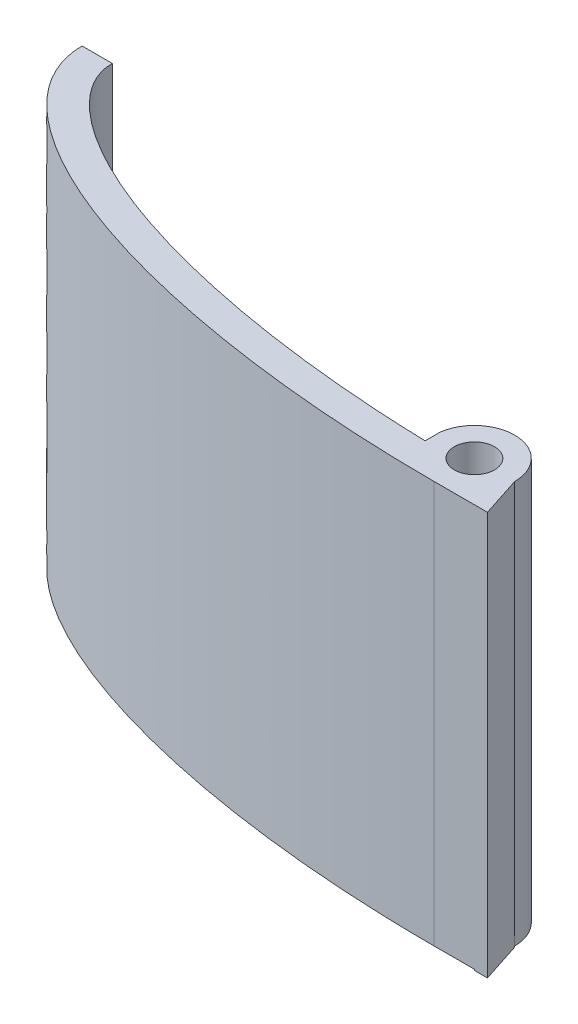
ISO-10303-21;
HEADER;
FILE_DESCRIPTION(('STEP AP214'),'2;1');
FILE_NAME('part.step','',(''),(''),'','','');
FILE_SCHEMA(('AUTOMOTIVE_DESIGN { 1 0 10303 214 1 1 1 1 }'));
ENDSEC;
DATA;
#1=APPLICATION_CONTEXT('core data for automotive mechanical design processes');
#2=APPLICATION_PROTOCOL_DEFINITION('international standard','automotive_design',2000,#1);
#3=PRODUCT_CONTEXT('',#1,'mechanical');
#4=PRODUCT('Part','Part','',(#3));
#5=PRODUCT_RELATED_PRODUCT_CATEGORY('part','',(#4));
#6=PRODUCT_DEFINITION_FORMATION('','',#4);
#7=PRODUCT_DEFINITION_CONTEXT('part definition',#1,'design');
#8=PRODUCT_DEFINITION('design','',#6,#7);
#9=PRODUCT_DEFINITION_SHAPE('','',#8);
#10=(LENGTH_UNIT() NAMED_UNIT(*) SI_UNIT(.MILLI.,.METRE.));
#11=(NAMED_UNIT(*) PLANE_ANGLE_UNIT() SI_UNIT($,.RADIAN.));
#12=(NAMED_UNIT(*) SI_UNIT($,.STERADIAN.) SOLID_ANGLE_UNIT());
#13=UNCERTAINTY_MEASURE_WITH_UNIT(LENGTH_MEASURE(1.E-05),#10,'distance_accuracy_value','');
#14=(GEOMETRIC_REPRESENTATION_CONTEXT(3) GLOBAL_UNCERTAINTY_ASSIGNED_CONTEXT((#13)) GLOBAL_UNIT_ASSIGNED_CONTEXT((#10,
#11,#12)) REPRESENTATION_CONTEXT('',''));
#15=CARTESIAN_POINT('',(0.,0.,0.));
#16=DIRECTION('',(0.,0.,1.));
#17=DIRECTION('',(1.,0.,0.));
#18=AXIS2_PLACEMENT_3D('',#15,#16,#17);
#19=CARTESIAN_POINT('',(-72.,-0.285000000000007,10.));
#20=CARTESIAN_POINT('',(-72.,-0.285000000000007,10.3551118767143));
#21=CARTESIAN_POINT('',(-71.9591063251687,-0.285000000000007,10.7023598460623));
#22=CARTESIAN_POINT('',(-71.7867798899807,-0.285000000000007,11.4192489810084));
#23=CARTESIAN_POINT('',(-71.6546183247109,-0.285000000000007,11.7894420273645));
#24=CARTESIAN_POINT('',(-71.2726751059899,-0.285000000000007,12.5716090379524));
#25=CARTESIAN_POINT('',(-71.0223694031362,-0.285000000000007,12.9832180086081));
#26=CARTESIAN_POINT('',(-70.541734895208,-0.285000000000007,13.6290919822721));
#27=CARTESIAN_POINT('',(-70.3640784725089,-0.285000000000007,13.8490001801886));
#28=CARTESIAN_POINT('',(-70.0701982631017,-0.285000000000007,14.1847971878832));
#29=CARTESIAN_POINT('',(-69.967677802851,-0.285000000000007,14.297716135593));
#30=CARTESIAN_POINT('',(-69.806948776203,-0.285000000000007,14.4684372666596));
#31=CARTESIAN_POINT('',(-69.7248476213654,-0.285000000000007,14.5541334428663));
#32=CARTESIAN_POINT('',(-69.6260046502194,-0.285000000000007,14.6546692845492));
#33=CARTESIAN_POINT('',(-69.5758164999879,-0.285000000000007,14.7050726596511));
#34=CARTESIAN_POINT('',(-69.5505305044692,-0.285000000000007,14.7303077386777));
#35=CARTESIAN_POINT('',(-69.5396524970482,-0.285000000000007,14.7411298773373));
#36=CARTESIAN_POINT('',(-69.5323913442827,-0.285000000000007,14.7483462096768));
#37=CARTESIAN_POINT('',(-69.527711762691,-0.285000000000007,14.7529909883076));
#38=CARTESIAN_POINT('',(-68.8607211181235,-0.285000000000007,15.4144860522359));
#39=CARTESIAN_POINT('',(-68.0597752546771,-0.285000000000007,16.0804789135653));
#40=CARTESIAN_POINT('',(-66.6450309885334,-0.285000000000007,17.0737876082818));
#41=CARTESIAN_POINT('',(-66.1380473617355,-0.285000000000007,17.4039523576474));
#42=CARTESIAN_POINT('',(-65.3243624975748,-0.285000000000007,17.8960794879706));
#43=CARTESIAN_POINT('',(-65.0442704072598,-0.285000000000007,18.059605242002));
#44=CARTESIAN_POINT('',(-64.6108542569676,-0.285000000000007,18.3039357645735));
#45=CARTESIAN_POINT('',(-64.3908269293376,-0.285000000000007,18.4258618234274));
#46=CARTESIAN_POINT('',(-64.1283258312012,-0.285000000000007,18.5676535865955));
#47=CARTESIAN_POINT('',(-63.9956255503256,-0.285000000000007,18.638431298872));
#48=CARTESIAN_POINT('',(-63.9289130925845,-0.285000000000007,18.673790076228));
#49=CARTESIAN_POINT('',(-63.89546629926,-0.285000000000007,18.6914618789662));
#50=CARTESIAN_POINT('',(-63.8811125542092,-0.285000000000007,18.699033876098));
#51=CARTESIAN_POINT('',(-63.8715390787881,-0.285000000000007,18.7040815106017));
#52=CARTESIAN_POINT('',(-63.8655392335619,-0.285000000000007,18.7072429560843));
#53=CARTESIAN_POINT('',(-62.0289488645667,-0.285000000000007,19.6745779455732));
#54=CARTESIAN_POINT('',(-59.9528782257426,-0.285000000000007,20.57833796299));
#55=CARTESIAN_POINT('',(-56.4755634499144,-0.285000000000007,21.826775958947));
#56=CARTESIAN_POINT('',(-55.2559929991906,-0.285000000000007,22.2251276123408));
#57=CARTESIAN_POINT('',(-53.3364610156703,-0.285000000000007,22.7947269015489));
#58=CARTESIAN_POINT('',(-52.3541524979884,-0.285000000000007,23.0725501494249));
#59=CARTESIAN_POINT('',(-51.1687995637805,-0.285000000000007,23.3842520444949));
#60=CARTESIAN_POINT('',(-50.5663069960969,-0.285000000000007,23.5369731401424));
#61=CARTESIAN_POINT('',(-50.2626086052154,-0.285000000000007,23.6125483562067));
#62=CARTESIAN_POINT('',(-50.1101466224485,-0.285000000000007,23.6501392837315));
#63=CARTESIAN_POINT('',(-50.0337624641158,-0.285000000000007,23.6688855345804));
#64=CARTESIAN_POINT('',(-50.0009935779683,-0.285000000000007,23.6769090919129));
#65=CARTESIAN_POINT('',(-49.9791403612718,-0.285000000000007,23.6822557851479));
#66=CARTESIAN_POINT('',(-49.96618026701,-0.285000000000007,23.6854238211354));
#67=CARTESIAN_POINT('',(-47.6778365502934,-0.285000000000007,24.2444346767417));
#68=CARTESIAN_POINT('',(-45.3026413819252,-0.285000000000007,24.7337975819237));
#69=CARTESIAN_POINT('',(-41.5963017967152,-0.285000000000007,25.3652161814251));
#70=CARTESIAN_POINT('',(-39.7072511452409,-0.285000000000007,25.6552731282619));
#71=CARTESIAN_POINT('',(-37.4406343488846,-0.285000000000007,25.9485161377419));
#72=CARTESIAN_POINT('',(-36.2916557378931,-0.285000000000007,26.083818686069));
#73=CARTESIAN_POINT('',(-35.7132502634823,-0.285000000000007,26.1486365891192));
#74=CARTESIAN_POINT('',(-35.423068663912,-0.285000000000007,26.1803367549963));
#75=CARTESIAN_POINT('',(-35.2777331713867,-0.285000000000007,26.1960095868544));
#76=CARTESIAN_POINT('',(-35.2153941000412,-0.285000000000007,26.2026885265985));
#77=CARTESIAN_POINT('',(-35.1738230679321,-0.285000000000007,26.2071327106288));
#78=CARTESIAN_POINT('',(-35.1515107397376,-0.285000000000007,26.2095124751269));
#79=CARTESIAN_POINT('',(-30.1975323268545,-0.285000000000007,26.7368136416308));
#80=CARTESIAN_POINT('',(-25.15393605695,-0.285000000000007,27.));
#81=CARTESIAN_POINT('',(-20.,-0.285000000000007,27.));
#82=B_SPLINE_CURVE_WITH_KNOTS('',3,(#19,#20,#21,#22,#23,#24,#25,#26,#27,#28,#29,#30,#31,#32,#33,
#34,#35,#36,#37,#38,#39,#40,#41,#42,#43,#44,#45,#46,#47,#48,#49,#50,#51,#52,#53,#54,#55,#56,#57,
#58,#59,#60,#61,#62,#63,#64,#65,#66,#67,#68,#69,#70,#71,#72,#73,#74,#75,#76,#77,#78,#79,#80,
#81),.UNSPECIFIED.,.F.,.F.,(4,2,2,2,2,2,1,1,1,1,2,2,2,2,2,1,1,1,1,1,2,2,2,2,1,1,1,1,1,1,2,2,2,1,
1,1,1,1,1,2,2,4),(0.,0.0312499999999769,0.0624999999999539,0.0937499999999308,0.10937499999992,
0.117187499999914,0.121093749999911,0.123046874999909,0.124023437499909,0.124511718749909,
0.124755859374909,0.124999999999909,0.187499999999849,0.218749999999819,0.234374999999803,
0.242187499999796,0.246093749999792,0.248046874999791,0.24902343749979,0.24951171874979,
0.24975585937479,0.24999999999979,0.374999999999868,0.437499999999907,0.468749999999927,
0.484374999999936,0.492187499999941,0.496093749999944,0.498046874999945,0.499023437499945,
0.499511718749946,0.499999999999946,0.624999999999972,0.687499999999984,0.718749999999991,
0.734374999999994,0.742187499999996,0.746093749999997,0.748046874999997,0.749023437499997,
0.749999999999997,1.),.UNSPECIFIED.);
#83=DIRECTION('',(0.,1.,0.));
#84=VECTOR('',#83,1.);
#85=SURFACE_OF_LINEAR_EXTRUSION('',#82,#84);
#86=CARTESIAN_POINT('',(-72.,40.,10.));
#87=CARTESIAN_POINT('',(-72.,40.,10.3551118767143));
#88=CARTESIAN_POINT('',(-71.9591063251687,40.,10.7023598460623));
#89=CARTESIAN_POINT('',(-71.7867798899807,40.,11.4192489810084));
#90=CARTESIAN_POINT('',(-71.6546183247109,40.,11.7894420273645));
#91=CARTESIAN_POINT('',(-71.2726751059899,40.,12.5716090379524));
#92=CARTESIAN_POINT('',(-71.0223694031362,40.,12.9832180086081));
#93=CARTESIAN_POINT('',(-70.541734895208,40.,13.6290919822721));
#94=CARTESIAN_POINT('',(-70.3640784725089,40.,13.8490001801886));
#95=CARTESIAN_POINT('',(-70.0701982631017,40.,14.1847971878832));
#96=CARTESIAN_POINT('',(-69.967677802851,40.,14.297716135593));
#97=CARTESIAN_POINT('',(-69.806948776203,40.,14.4684372666596));
#98=CARTESIAN_POINT('',(-69.7248476213654,40.,14.5541334428663));
#99=CARTESIAN_POINT('',(-69.6260046502194,40.,14.6546692845492));
#100=CARTESIAN_POINT('',(-69.5758164999879,40.,14.7050726596511));
#101=CARTESIAN_POINT('',(-69.5505305044692,40.,14.7303077386777));
#102=CARTESIAN_POINT('',(-69.5396524970482,40.,14.7411298773373));
#103=CARTESIAN_POINT('',(-69.5323913442827,40.,14.7483462096768));
#104=CARTESIAN_POINT('',(-69.527711762691,40.,14.7529909883076));
#105=CARTESIAN_POINT('',(-68.8607211181235,40.,15.4144860522359));
#106=CARTESIAN_POINT('',(-68.0597752546771,40.,16.0804789135653));
#107=CARTESIAN_POINT('',(-66.6450309885334,40.,17.0737876082818));
#108=CARTESIAN_POINT('',(-66.1380473617355,40.,17.4039523576474));
#109=CARTESIAN_POINT('',(-65.3243624975748,40.,17.8960794879706));
#110=CARTESIAN_POINT('',(-65.0442704072598,40.,18.059605242002));
#111=CARTESIAN_POINT('',(-64.6108542569676,40.,18.3039357645735));
#112=CARTESIAN_POINT('',(-64.3908269293376,40.,18.4258618234274));
#113=CARTESIAN_POINT('',(-64.1283258312012,40.,18.5676535865955));
#114=CARTESIAN_POINT('',(-63.9956255503256,40.,18.638431298872));
#115=CARTESIAN_POINT('',(-63.9289130925845,40.,18.673790076228));
#116=CARTESIAN_POINT('',(-63.89546629926,40.,18.6914618789662));
#117=CARTESIAN_POINT('',(-63.8811125542092,40.,18.699033876098));
#118=CARTESIAN_POINT('',(-63.8715390787881,40.,18.7040815106017));
#119=CARTESIAN_POINT('',(-63.8655392335619,40.,18.7072429560843));
#120=CARTESIAN_POINT('',(-62.0289488645667,40.,19.6745779455732));
#121=CARTESIAN_POINT('',(-59.9528782257426,40.,20.57833796299));
#122=CARTESIAN_POINT('',(-56.4755634499144,40.,21.826775958947));
#123=CARTESIAN_POINT('',(-55.2559929991906,40.,22.2251276123408));
#124=CARTESIAN_POINT('',(-53.3364610156703,40.,22.7947269015489));
#125=CARTESIAN_POINT('',(-52.3541524979884,40.,23.0725501494249));
#126=CARTESIAN_POINT('',(-51.1687995637805,40.,23.3842520444949));
#127=CARTESIAN_POINT('',(-50.5663069960969,40.,23.5369731401424));
#128=CARTESIAN_POINT('',(-50.2626086052154,40.,23.6125483562067));
#129=CARTESIAN_POINT('',(-50.1101466224485,40.,23.6501392837315));
#130=CARTESIAN_POINT('',(-50.0337624641158,40.,23.6688855345804));
#131=CARTESIAN_POINT('',(-50.0009935779683,40.,23.6769090919129));
#132=CARTESIAN_POINT('',(-49.9791403612718,40.,23.6822557851479));
#133=CARTESIAN_POINT('',(-49.96618026701,40.,23.6854238211354));
#134=CARTESIAN_POINT('',(-47.6778365502934,40.,24.2444346767417));
#135=CARTESIAN_POINT('',(-45.3026413819252,40.,24.7337975819237));
#136=CARTESIAN_POINT('',(-41.5963017967152,40.,25.3652161814251));
#137=CARTESIAN_POINT('',(-39.7072511452409,40.,25.6552731282619));
#138=CARTESIAN_POINT('',(-37.4406343488846,40.,25.9485161377419));
#139=CARTESIAN_POINT('',(-36.2916557378931,40.,26.083818686069));
#140=CARTESIAN_POINT('',(-35.7132502634823,40.,26.1486365891192));
#141=CARTESIAN_POINT('',(-35.423068663912,40.,26.1803367549963));
#142=CARTESIAN_POINT('',(-35.2777331713867,40.,26.1960095868544));
#143=CARTESIAN_POINT('',(-35.2153941000412,40.,26.2026885265985));
#144=CARTESIAN_POINT('',(-35.1738230679321,40.,26.2071327106288));
#145=CARTESIAN_POINT('',(-35.1515107397376,40.,26.2095124751269));
#146=CARTESIAN_POINT('',(-30.1975323268545,40.,26.7368136416308));
#147=CARTESIAN_POINT('',(-25.15393605695,40.,27.));
#148=CARTESIAN_POINT('',(-20.,40.,27.));
#149=B_SPLINE_CURVE_WITH_KNOTS('',3,(#86,#87,#88,#89,#90,#91,#92,#93,#94,#95,#96,#97,#98,#99,
#100,#101,#102,#103,#104,#105,#106,#107,#108,#109,#110,#111,#112,#113,#114,#115,#116,#117,#118,
#119,#120,#121,#122,#123,#124,#125,#126,#127,#128,#129,#130,#131,#132,#133,#134,#135,#136,#137,
#138,#139,#140,#141,#142,#143,#144,#145,#146,#147,#148),.UNSPECIFIED.,.F.,.F.,(4,2,2,2,2,2,1,1,
1,1,2,2,2,2,2,1,1,1,1,1,2,2,2,2,1,1,1,1,1,1,2,2,2,1,1,1,1,1,1,2,2,4),(0.,0.0312499999999769,
0.0624999999999539,0.0937499999999308,0.10937499999992,0.117187499999914,0.121093749999911,
0.123046874999909,0.124023437499909,0.124511718749909,0.124755859374909,0.124999999999909,
0.187499999999849,0.218749999999819,0.234374999999803,0.242187499999796,0.246093749999792,
0.248046874999791,0.24902343749979,0.24951171874979,0.24975585937479,0.24999999999979,
0.374999999999868,0.437499999999907,0.468749999999927,0.484374999999936,0.492187499999941,
0.496093749999944,0.498046874999945,0.499023437499945,0.499511718749946,0.499999999999946,
0.624999999999972,0.687499999999984,0.718749999999991,0.734374999999994,0.742187499999996,
0.746093749999997,0.748046874999997,0.749023437499997,0.749999999999997,1.),.UNSPECIFIED.);
#150=CARTESIAN_POINT('',(-72.,40.,10.));
#151=VERTEX_POINT('',#150);
#152=CARTESIAN_POINT('',(-23.9545595077882,40.,26.9477974740407));
#153=VERTEX_POINT('',#152);
#154=EDGE_CURVE('E148',#151,#153,#149,.T.);
#155=ORIENTED_EDGE('',*,*,#154,.T.);
#156=DIRECTION('',(0.,1.,0.));
#157=VECTOR('',#156,1.);
#158=CARTESIAN_POINT('',(-23.9545595077892,-0.285000000000007,26.9477974740407));
#159=LINE('',#158,#157);
#160=CARTESIAN_POINT('',(-23.9545595077882,0.,26.9477974740407));
#161=VERTEX_POINT('',#160);
#162=EDGE_CURVE('E264',#161,#153,#159,.T.);
#163=ORIENTED_EDGE('',*,*,#162,.F.);
#164=CARTESIAN_POINT('',(-72.,0.,10.));
#165=CARTESIAN_POINT('',(-72.,0.,10.3551118767143));
#166=CARTESIAN_POINT('',(-71.9591063251687,0.,10.7023598460623));
#167=CARTESIAN_POINT('',(-71.7867798899807,0.,11.4192489810084));
#168=CARTESIAN_POINT('',(-71.6546183247109,0.,11.7894420273645));
#169=CARTESIAN_POINT('',(-71.2726751059899,0.,12.5716090379524));
#170=CARTESIAN_POINT('',(-71.0223694031362,0.,12.9832180086081));
#171=CARTESIAN_POINT('',(-70.541734895208,0.,13.6290919822721));
#172=CARTESIAN_POINT('',(-70.3640784725089,0.,13.8490001801886));
#173=CARTESIAN_POINT('',(-70.0701982631017,0.,14.1847971878832));
#174=CARTESIAN_POINT('',(-69.967677802851,0.,14.297716135593));
#175=CARTESIAN_POINT('',(-69.806948776203,0.,14.4684372666596));
#176=CARTESIAN_POINT('',(-69.7248476213654,0.,14.5541334428663));
#177=CARTESIAN_POINT('',(-69.6260046502194,0.,14.6546692845492));
#178=CARTESIAN_POINT('',(-69.5758164999879,0.,14.7050726596511));
#179=CARTESIAN_POINT('',(-69.5505305044692,0.,14.7303077386777));
#180=CARTESIAN_POINT('',(-69.5396524970482,0.,14.7411298773373));
#181=CARTESIAN_POINT('',(-69.5323913442827,0.,14.7483462096768));
#182=CARTESIAN_POINT('',(-69.527711762691,0.,14.7529909883076));
#183=CARTESIAN_POINT('',(-68.8607211181235,0.,15.4144860522359));
#184=CARTESIAN_POINT('',(-68.0597752546771,0.,16.0804789135653));
#185=CARTESIAN_POINT('',(-66.6450309885334,0.,17.0737876082818));
#186=CARTESIAN_POINT('',(-66.1380473617355,0.,17.4039523576474));
#187=CARTESIAN_POINT('',(-65.3243624975748,0.,17.8960794879706));
#188=CARTESIAN_POINT('',(-65.0442704072598,0.,18.059605242002));
#189=CARTESIAN_POINT('',(-64.6108542569676,0.,18.3039357645735));
#190=CARTESIAN_POINT('',(-64.3908269293376,0.,18.4258618234274));
#191=CARTESIAN_POINT('',(-64.1283258312012,0.,18.5676535865955));
#192=CARTESIAN_POINT('',(-63.9956255503256,0.,18.638431298872));
#193=CARTESIAN_POINT('',(-63.9289130925845,0.,18.673790076228));
#194=CARTESIAN_POINT('',(-63.89546629926,0.,18.6914618789662));
#195=CARTESIAN_POINT('',(-63.8811125542092,0.,18.699033876098));
#196=CARTESIAN_POINT('',(-63.8715390787881,0.,18.7040815106017));
#197=CARTESIAN_POINT('',(-63.8655392335619,0.,18.7072429560843));
#198=CARTESIAN_POINT('',(-62.0289488645667,0.,19.6745779455732));
#199=CARTESIAN_POINT('',(-59.9528782257426,0.,20.57833796299));
#200=CARTESIAN_POINT('',(-56.4755634499144,0.,21.826775958947));
#201=CARTESIAN_POINT('',(-55.2559929991906,0.,22.2251276123408));
#202=CARTESIAN_POINT('',(-53.3364610156703,0.,22.7947269015489));
#203=CARTESIAN_POINT('',(-52.3541524979884,0.,23.0725501494249));
#204=CARTESIAN_POINT('',(-51.1687995637805,0.,23.3842520444949));
#205=CARTESIAN_POINT('',(-50.5663069960969,0.,23.5369731401424));
#206=CARTESIAN_POINT('',(-50.2626086052154,0.,23.6125483562067));
#207=CARTESIAN_POINT('',(-50.1101466224485,0.,23.6501392837315));
#208=CARTESIAN_POINT('',(-50.0337624641158,0.,23.6688855345804));
#209=CARTESIAN_POINT('',(-50.0009935779683,0.,23.6769090919129));
#210=CARTESIAN_POINT('',(-49.9791403612718,0.,23.6822557851479));
#211=CARTESIAN_POINT('',(-49.96618026701,0.,23.6854238211354));
#212=CARTESIAN_POINT('',(-47.6778365502934,0.,24.2444346767417));
#213=CARTESIAN_POINT('',(-45.3026413819252,0.,24.7337975819237));
#214=CARTESIAN_POINT('',(-41.5963017967152,0.,25.3652161814251));
#215=CARTESIAN_POINT('',(-39.7072511452409,0.,25.6552731282619));
#216=CARTESIAN_POINT('',(-37.4406343488846,0.,25.9485161377419));
#217=CARTESIAN_POINT('',(-36.2916557378931,0.,26.083818686069));
#218=CARTESIAN_POINT('',(-35.7132502634823,0.,26.1486365891192));
#219=CARTESIAN_POINT('',(-35.423068663912,0.,26.1803367549963));
#220=CARTESIAN_POINT('',(-35.2777331713867,0.,26.1960095868544));
#221=CARTESIAN_POINT('',(-35.2153941000412,0.,26.2026885265985));
#222=CARTESIAN_POINT('',(-35.1738230679321,0.,26.2071327106288));
#223=CARTESIAN_POINT('',(-35.1515107397376,0.,26.2095124751269));
#224=CARTESIAN_POINT('',(-30.1975323268545,0.,26.7368136416308));
#225=CARTESIAN_POINT('',(-25.15393605695,0.,27.));
#226=CARTESIAN_POINT('',(-20.,0.,27.));
#227=B_SPLINE_CURVE_WITH_KNOTS('',3,(#164,#165,#166,#167,#168,#169,#170,#171,#172,#173,#174,
#175,#176,#177,#178,#179,#180,#181,#182,#183,#184,#185,#186,#187,#188,#189,#190,#191,#192,#193,
#194,#195,#196,#197,#198,#199,#200,#201,#202,#203,#204,#205,#206,#207,#208,#209,#210,#211,#212,
#213,#214,#215,#216,#217,#218,#219,#220,#221,#222,#223,#224,#225,#226),.UNSPECIFIED.,.F.,.F.,(4,
2,2,2,2,2,1,1,1,1,2,2,2,2,2,1,1,1,1,1,2,2,2,2,1,1,1,1,1,1,2,2,2,1,1,1,1,1,1,2,2,4),(0.,
0.0312499999999769,0.0624999999999539,0.0937499999999308,0.10937499999992,0.117187499999914,
0.121093749999911,0.123046874999909,0.124023437499909,0.124511718749909,0.124755859374909,
0.124999999999909,0.187499999999849,0.218749999999819,0.234374999999803,0.242187499999796,
0.246093749999792,0.248046874999791,0.24902343749979,0.24951171874979,0.24975585937479,
0.24999999999979,0.374999999999868,0.437499999999907,0.468749999999927,0.484374999999936,
0.492187499999941,0.496093749999944,0.498046874999945,0.499023437499945,0.499511718749946,
0.499999999999946,0.624999999999972,0.687499999999984,0.718749999999991,0.734374999999994,
0.742187499999996,0.746093749999997,0.748046874999997,0.749023437499997,0.749999999999997,1.),.UNSPECIFIED.);
#228=CARTESIAN_POINT('',(-72.,0.,10.));
#229=VERTEX_POINT('',#228);
#230=EDGE_CURVE('E255',#229,#161,#227,.T.);
#231=ORIENTED_EDGE('',*,*,#230,.F.);
#232=DIRECTION('',(0.,1.,0.));
#233=VECTOR('',#232,1.);
#234=CARTESIAN_POINT('',(-72.,-0.285000000000007,10.));
#235=LINE('',#234,#233);
#236=EDGE_CURVE('E144',#229,#151,#235,.T.);
#237=ORIENTED_EDGE('',*,*,#236,.T.);
#238=EDGE_LOOP('',(#155,#163,#231,#237));
#239=FACE_BOUND('',#238,.T.);
#240=ADVANCED_FACE('F34',(#239),#85,.F.);
#241=CARTESIAN_POINT('',(-23.9545595077892,-0.285000000000007,26.9477974740407));
#242=DIRECTION('',(1.,0.,0.));
#243=DIRECTION('',(0.,0.,-1.));
#244=AXIS2_PLACEMENT_3D('',#241,#242,#243);
#245=PLANE('',#244);
#246=DIRECTION('',(0.,0.,-1.));
#247=VECTOR('',#246,1.);
#248=CARTESIAN_POINT('',(-23.9545595077892,40.,0.));
#249=LINE('',#248,#247);
#250=CARTESIAN_POINT('',(-23.9545595077892,40.,25.3987853134245));
#251=VERTEX_POINT('',#250);
#252=EDGE_CURVE('E159',#153,#251,#249,.T.);
#253=ORIENTED_EDGE('',*,*,#252,.T.);
#254=DIRECTION('',(0.,1.,0.));
#255=VECTOR('',#254,1.);
#256=CARTESIAN_POINT('',(-23.9545595077892,-0.285000000000007,25.3987853134245));
#257=LINE('',#256,#255);
#258=CARTESIAN_POINT('',(-23.9545595077892,0.,25.3987853134245));
#259=VERTEX_POINT('',#258);
#260=EDGE_CURVE('E261',#259,#251,#257,.T.);
#261=ORIENTED_EDGE('',*,*,#260,.F.);
#262=DIRECTION('',(0.,0.,-1.));
#263=VECTOR('',#262,1.);
#264=CARTESIAN_POINT('',(-23.9545595077892,0.,0.));
#265=LINE('',#264,#263);
#266=EDGE_CURVE('E315',#161,#259,#265,.T.);
#267=ORIENTED_EDGE('',*,*,#266,.F.);
#268=ORIENTED_EDGE('',*,*,#162,.T.);
#269=EDGE_LOOP('',(#253,#261,#267,#268));
#270=FACE_BOUND('',#269,.T.);
#271=ADVANCED_FACE('F281',(#270),#245,.F.);
#272=CARTESIAN_POINT('',(-20.,-0.285000000000007,26.));
#273=DIRECTION('',(0.,1.,0.));
#274=DIRECTION('',(0.,0.,1.));
#275=AXIS2_PLACEMENT_3D('',#272,#273,#274);
#276=CYLINDRICAL_SURFACE('',#275,4.00000000000001);
#277=CARTESIAN_POINT('',(-20.,40.,26.));
#278=DIRECTION('',(0.,1.,0.));
#279=DIRECTION('',(0.,0.,1.));
#280=AXIS2_PLACEMENT_3D('',#277,#278,#279);
#281=CIRCLE('',#280,4.00000000000001);
#282=CARTESIAN_POINT('',(-16.,40.,26.));
#283=VERTEX_POINT('',#282);
#284=EDGE_CURVE('E164',#251,#283,#281,.F.);
#285=ORIENTED_EDGE('',*,*,#284,.T.);
#286=DIRECTION('',(0.,1.,0.));
#287=VECTOR('',#286,1.);
#288=CARTESIAN_POINT('',(-16.,-0.285000000000007,26.));
#289=LINE('',#288,#287);
#290=CARTESIAN_POINT('',(-16.,0.,26.));
#291=VERTEX_POINT('',#290);
#292=EDGE_CURVE('E39',#291,#283,#289,.T.);
#293=ORIENTED_EDGE('',*,*,#292,.F.);
#294=CARTESIAN_POINT('',(-20.,0.,26.));
#295=DIRECTION('',(0.,1.,0.));
#296=DIRECTION('',(0.,0.,1.));
#297=AXIS2_PLACEMENT_3D('',#294,#295,#296);
#298=CIRCLE('',#297,4.00000000000001);
#299=EDGE_CURVE('E312',#259,#291,#298,.F.);
#300=ORIENTED_EDGE('',*,*,#299,.F.);
#301=ORIENTED_EDGE('',*,*,#260,.T.);
#302=EDGE_LOOP('',(#285,#293,#300,#301));
#303=FACE_BOUND('',#302,.T.);
#304=ADVANCED_FACE('F287',(#303),#276,.T.);
#305=CARTESIAN_POINT('',(-72.,-0.285000000000007,10.));
#306=DIRECTION('',(0.,0.,1.));
#307=DIRECTION('',(1.,0.,0.));
#308=AXIS2_PLACEMENT_3D('',#305,#306,#307);
#309=PLANE('',#308);
#310=DIRECTION('',(1.,0.,0.));
#311=VECTOR('',#310,1.);
#312=CARTESIAN_POINT('',(0.,40.,10.0000000000001));
#313=LINE('',#312,#311);
#314=CARTESIAN_POINT('',(-75.,40.,10.));
#315=VERTEX_POINT('',#314);
#316=EDGE_CURVE('E145',#315,#151,#313,.T.);
#317=ORIENTED_EDGE('',*,*,#316,.T.);
#318=ORIENTED_EDGE('',*,*,#236,.F.);
#319=DIRECTION('',(1.,0.,0.));
#320=VECTOR('',#319,1.);
#321=CARTESIAN_POINT('',(0.,0.,10.0000000000001));
#322=LINE('',#321,#320);
#323=CARTESIAN_POINT('',(-75.,0.,10.));
#324=VERTEX_POINT('',#323);
#325=EDGE_CURVE('E247',#324,#229,#322,.T.);
#326=ORIENTED_EDGE('',*,*,#325,.F.);
#327=CARTESIAN_POINT('',(-75.,42.,10.));
#328=CARTESIAN_POINT('',(-75.,27.3333333333333,10.));
#329=CARTESIAN_POINT('',(-75.,12.6666666666667,10.));
#330=CARTESIAN_POINT('',(-75.,-2.,10.));
#331=(BOUNDED_CURVE() B_SPLINE_CURVE(3,(#327,#328,#329,#330),.UNSPECIFIED.,.F.,
.F.) B_SPLINE_CURVE_WITH_KNOTS((4,4),(-0.002,0.042),
.UNSPECIFIED.) CURVE() GEOMETRIC_REPRESENTATION_ITEM() RATIONAL_B_SPLINE_CURVE((1.,1.,1.,1.)) REPRESENTATION_ITEM(''));
#332=EDGE_CURVE('E149',#324,#315,#331,.F.);
#333=ORIENTED_EDGE('',*,*,#332,.T.);
#334=EDGE_LOOP('',(#317,#318,#326,#333));
#335=FACE_BOUND('',#334,.T.);
#336=ADVANCED_FACE('F290',(#335),#309,.F.);
#337=CARTESIAN_POINT('',(-75.,40.,30.));
#338=DIRECTION('',(0.,0.,-1.));
#339=DIRECTION('',(-1.,0.,0.));
#340=AXIS2_PLACEMENT_3D('',#337,#338,#339);
#341=PLANE('',#340);
#342=DIRECTION('',(1.,0.,0.));
#343=VECTOR('',#342,1.);
#344=CARTESIAN_POINT('',(-75.,0.,30.));
#345=LINE('',#344,#343);
#346=CARTESIAN_POINT('',(-20.,0.,30.));
#347=VERTEX_POINT('',#346);
#348=CARTESIAN_POINT('',(-16.,0.,30.));
#349=VERTEX_POINT('',#348);
#350=EDGE_CURVE('E11',#347,#349,#345,.T.);
#351=ORIENTED_EDGE('',*,*,#350,.T.);
#352=DIRECTION('',(0.,1.,0.));
#353=VECTOR('',#352,1.);
#354=CARTESIAN_POINT('',(-16.,-0.10000000000001,30.));
#355=LINE('',#354,#353);
#356=CARTESIAN_POINT('',(-16.,-0.10000000000001,30.));
#357=VERTEX_POINT('',#356);
#358=EDGE_CURVE('E109',#357,#349,#355,.T.);
#359=ORIENTED_EDGE('',*,*,#358,.F.);
#360=DIRECTION('',(1.,0.,0.));
#361=VECTOR('',#360,1.);
#362=CARTESIAN_POINT('',(-16.,-0.10000000000001,30.));
#363=LINE('',#362,#361);
#364=CARTESIAN_POINT('',(-14.7,-0.10000000000001,30.));
#365=VERTEX_POINT('',#364);
#366=EDGE_CURVE('E112',#357,#365,#363,.T.);
#367=ORIENTED_EDGE('',*,*,#366,.T.);
#368=DIRECTION('',(0.,1.,0.));
#369=VECTOR('',#368,1.);
#370=CARTESIAN_POINT('',(-14.7,-0.10000000000001,30.));
#371=LINE('',#370,#369);
#372=CARTESIAN_POINT('',(-14.7,40.,30.));
#373=VERTEX_POINT('',#372);
#374=EDGE_CURVE('E118',#365,#373,#371,.T.);
#375=ORIENTED_EDGE('',*,*,#374,.T.);
#376=DIRECTION('',(1.,0.,0.));
#377=VECTOR('',#376,1.);
#378=CARTESIAN_POINT('',(-75.,40.,30.));
#379=LINE('',#378,#377);
#380=CARTESIAN_POINT('',(-20.,40.,30.));
#381=VERTEX_POINT('',#380);
#382=EDGE_CURVE('E44',#381,#373,#379,.T.);
#383=ORIENTED_EDGE('',*,*,#382,.F.);
#384=CARTESIAN_POINT('',(-20.,-2.,30.));
#385=CARTESIAN_POINT('',(-20.,12.6666666666667,30.));
#386=CARTESIAN_POINT('',(-20.,27.3333333333333,30.));
#387=CARTESIAN_POINT('',(-20.,42.,30.));
#388=(BOUNDED_CURVE() B_SPLINE_CURVE(3,(#384,#385,#386,#387),.UNSPECIFIED.,.F.,
.F.) B_SPLINE_CURVE_WITH_KNOTS((4,4),(-0.002,0.042),
.UNSPECIFIED.) CURVE() GEOMETRIC_REPRESENTATION_ITEM() RATIONAL_B_SPLINE_CURVE((1.,1.,1.,1.)) REPRESENTATION_ITEM(''));
#389=EDGE_CURVE('E172',#381,#347,#388,.F.);
#390=ORIENTED_EDGE('',*,*,#389,.T.);
#391=EDGE_LOOP('',(#351,#359,#367,#375,#383,#390));
#392=FACE_BOUND('',#391,.T.);
#393=ADVANCED_FACE('F36',(#392),#341,.F.);
#394=CARTESIAN_POINT('',(0.,0.,0.));
#395=DIRECTION('',(0.,1.,0.));
#396=DIRECTION('',(0.,0.,1.));
#397=AXIS2_PLACEMENT_3D('',#394,#395,#396);
#398=PLANE('',#397);
#399=CARTESIAN_POINT('',(-20.,0.,26.));
#400=DIRECTION('',(0.,1.,0.));
#401=DIRECTION('',(0.,0.,1.));
#402=AXIS2_PLACEMENT_3D('',#399,#400,#401);
#403=CIRCLE('',#402,2.);
#404=CARTESIAN_POINT('',(-20.,0.,28.));
#405=VERTEX_POINT('',#404);
#406=EDGE_CURVE('E141',#405,#405,#403,.T.);
#407=ORIENTED_EDGE('',*,*,#406,.T.);
#408=EDGE_LOOP('',(#407));
#409=FACE_BOUND('',#408,.T.);
#410=ORIENTED_EDGE('',*,*,#299,.T.);
#411=DIRECTION('',(0.,0.,1.));
#412=VECTOR('',#411,1.);
#413=CARTESIAN_POINT('',(-16.,0.,0.));
#414=LINE('',#413,#412);
#415=EDGE_CURVE('E166',#291,#349,#414,.T.);
#416=ORIENTED_EDGE('',*,*,#415,.T.);
#417=ORIENTED_EDGE('',*,*,#350,.F.);
#418=CARTESIAN_POINT('',(-75.,0.,10.));
#419=CARTESIAN_POINT('',(-75.,0.,30.));
#420=CARTESIAN_POINT('',(-20.,0.,30.));
#421=(BOUNDED_CURVE() B_SPLINE_CURVE(2,(#418,#419,#420),.UNSPECIFIED.,.F.,
.F.) B_SPLINE_CURVE_WITH_KNOTS((3,3),(0.,1.),
.UNSPECIFIED.) CURVE() GEOMETRIC_REPRESENTATION_ITEM() RATIONAL_B_SPLINE_CURVE((1.,
0.707106781186548,1.)) REPRESENTATION_ITEM(''));
#422=EDGE_CURVE('E52',#347,#324,#421,.F.);
#423=ORIENTED_EDGE('',*,*,#422,.T.);
#424=ORIENTED_EDGE('',*,*,#325,.T.);
#425=ORIENTED_EDGE('',*,*,#230,.T.);
#426=ORIENTED_EDGE('',*,*,#266,.T.);
#427=EDGE_LOOP('',(#410,#416,#417,#423,#424,#425,#426));
#428=FACE_BOUND('',#427,.T.);
#429=ADVANCED_FACE('F189',(#409,#428),#398,.F.);
#430=CARTESIAN_POINT('',(0.,40.,0.));
#431=DIRECTION('',(0.,1.,0.));
#432=DIRECTION('',(0.,0.,1.));
#433=AXIS2_PLACEMENT_3D('',#430,#431,#432);
#434=PLANE('',#433);
#435=CARTESIAN_POINT('',(-20.,40.,26.));
#436=DIRECTION('',(0.,1.,0.));
#437=DIRECTION('',(0.,0.,1.));
#438=AXIS2_PLACEMENT_3D('',#435,#436,#437);
#439=CIRCLE('',#438,2.);
#440=CARTESIAN_POINT('',(-20.,40.,28.));
#441=VERTEX_POINT('',#440);
#442=EDGE_CURVE('E137',#441,#441,#439,.T.);
#443=ORIENTED_EDGE('',*,*,#442,.F.);
#444=EDGE_LOOP('',(#443));
#445=FACE_BOUND('',#444,.T.);
#446=ORIENTED_EDGE('',*,*,#382,.T.);
#447=DIRECTION('',(-0.309086072337558,0.,-0.951034068730948));
#448=VECTOR('',#447,1.);
#449=CARTESIAN_POINT('',(-14.7,40.,30.));
#450=LINE('',#449,#448);
#451=EDGE_CURVE('E130',#373,#283,#450,.T.);
#452=ORIENTED_EDGE('',*,*,#451,.T.);
#453=ORIENTED_EDGE('',*,*,#284,.F.);
#454=ORIENTED_EDGE('',*,*,#252,.F.);
#455=ORIENTED_EDGE('',*,*,#154,.F.);
#456=ORIENTED_EDGE('',*,*,#316,.F.);
#457=CARTESIAN_POINT('',(-20.,40.,30.));
#458=CARTESIAN_POINT('',(-75.,40.,30.));
#459=CARTESIAN_POINT('',(-75.,40.,10.));
#460=(BOUNDED_CURVE() B_SPLINE_CURVE(2,(#457,#458,#459),.UNSPECIFIED.,.F.,
.F.) B_SPLINE_CURVE_WITH_KNOTS((3,3),(0.,1.),
.UNSPECIFIED.) CURVE() GEOMETRIC_REPRESENTATION_ITEM() RATIONAL_B_SPLINE_CURVE((1.,
0.707106781186547,1.)) REPRESENTATION_ITEM(''));
#461=EDGE_CURVE('E61',#315,#381,#460,.F.);
#462=ORIENTED_EDGE('',*,*,#461,.T.);
#463=EDGE_LOOP('',(#446,#452,#453,#454,#455,#456,#462));
#464=FACE_BOUND('',#463,.T.);
#465=ADVANCED_FACE('F198',(#445,#464),#434,.T.);
#466=CARTESIAN_POINT('',(-20.,42.,30.));
#467=CARTESIAN_POINT('',(-20.,27.3333333333333,30.));
#468=CARTESIAN_POINT('',(-20.,12.6666666666667,30.));
#469=CARTESIAN_POINT('',(-20.,-2.,30.));
#470=CARTESIAN_POINT('',(-75.,42.,30.));
#471=CARTESIAN_POINT('',(-75.,27.3333333333333,30.));
#472=CARTESIAN_POINT('',(-75.,12.6666666666667,30.));
#473=CARTESIAN_POINT('',(-75.,-2.,30.));
#474=CARTESIAN_POINT('',(-75.,42.,10.));
#475=CARTESIAN_POINT('',(-75.,27.3333333333333,10.));
#476=CARTESIAN_POINT('',(-75.,12.6666666666667,10.));
#477=CARTESIAN_POINT('',(-75.,-2.,10.));
#478=(BOUNDED_SURFACE() B_SPLINE_SURFACE(2,3,((#466,#467,#468,#469),(#470,#471,#472,#473),(#474,
#475,#476,#477)),.UNSPECIFIED.,.F.,.F.,.F.) B_SPLINE_SURFACE_WITH_KNOTS((3,3),(4,4),(0.,1.),
(-0.002,0.042),.UNSPECIFIED.) GEOMETRIC_REPRESENTATION_ITEM() RATIONAL_B_SPLINE_SURFACE(((1.,1.,
1.,1.),(0.707106781186548,0.707106781186548,0.707106781186548,0.707106781186548),(1.,1.,1.,1.))) REPRESENTATION_ITEM('') SURFACE());
#479=ORIENTED_EDGE('',*,*,#461,.F.);
#480=ORIENTED_EDGE('',*,*,#332,.F.);
#481=ORIENTED_EDGE('',*,*,#422,.F.);
#482=ORIENTED_EDGE('',*,*,#389,.F.);
#483=EDGE_LOOP('',(#479,#480,#481,#482));
#484=FACE_BOUND('',#483,.T.);
#485=ADVANCED_FACE('F201',(#484),#478,.T.);
#486=CARTESIAN_POINT('',(-20.,-0.10000000000001,26.));
#487=DIRECTION('',(0.,1.,0.));
#488=DIRECTION('',(0.,0.,1.));
#489=AXIS2_PLACEMENT_3D('',#486,#487,#488);
#490=CYLINDRICAL_SURFACE('',#489,2.);
#491=ORIENTED_EDGE('',*,*,#442,.T.);
#492=EDGE_LOOP('',(#491));
#493=FACE_BOUND('',#492,.T.);
#494=ORIENTED_EDGE('',*,*,#406,.F.);
#495=EDGE_LOOP('',(#494));
#496=FACE_BOUND('',#495,.T.);
#497=ADVANCED_FACE('F283',(#493,#496),#490,.F.);
#498=CARTESIAN_POINT('',(-16.,-0.10000000000001,30.));
#499=DIRECTION('',(-1.,0.,0.));
#500=DIRECTION('',(0.,0.,1.));
#501=AXIS2_PLACEMENT_3D('',#498,#499,#500);
#502=PLANE('',#501);
#503=ORIENTED_EDGE('',*,*,#415,.F.);
#504=DIRECTION('',(0.,1.,0.));
#505=VECTOR('',#504,1.);
#506=CARTESIAN_POINT('',(-16.,-0.10000000000001,26.));
#507=LINE('',#506,#505);
#508=CARTESIAN_POINT('',(-16.,-0.10000000000001,26.));
#509=VERTEX_POINT('',#508);
#510=EDGE_CURVE('E129',#509,#291,#507,.T.);
#511=ORIENTED_EDGE('',*,*,#510,.F.);
#512=DIRECTION('',(0.,0.,1.));
#513=VECTOR('',#512,1.);
#514=CARTESIAN_POINT('',(-16.,-0.10000000000001,30.));
#515=LINE('',#514,#513);
#516=EDGE_CURVE('E124',#509,#357,#515,.T.);
#517=ORIENTED_EDGE('',*,*,#516,.T.);
#518=ORIENTED_EDGE('',*,*,#358,.T.);
#519=EDGE_LOOP('',(#503,#511,#517,#518));
#520=FACE_BOUND('',#519,.T.);
#521=ADVANCED_FACE('F127',(#520),#502,.T.);
#522=CARTESIAN_POINT('',(-14.7,-0.10000000000001,30.));
#523=DIRECTION('',(0.951034068730948,0.,-0.309086072337558));
#524=DIRECTION('',(-0.309086072337558,0.,-0.951034068730948));
#525=AXIS2_PLACEMENT_3D('',#522,#523,#524);
#526=PLANE('',#525);
#527=ORIENTED_EDGE('',*,*,#451,.F.);
#528=ORIENTED_EDGE('',*,*,#374,.F.);
#529=DIRECTION('',(-0.309086072337558,0.,-0.951034068730948));
#530=VECTOR('',#529,1.);
#531=CARTESIAN_POINT('',(-14.7,-0.10000000000001,30.));
#532=LINE('',#531,#530);
#533=EDGE_CURVE('E119',#365,#509,#532,.T.);
#534=ORIENTED_EDGE('',*,*,#533,.T.);
#535=ORIENTED_EDGE('',*,*,#510,.T.);
#536=ORIENTED_EDGE('',*,*,#292,.T.);
#537=EDGE_LOOP('',(#527,#528,#534,#535,#536));
#538=FACE_BOUND('',#537,.T.);
#539=ADVANCED_FACE('F307',(#538),#526,.T.);
#540=CARTESIAN_POINT('',(0.,-0.10000000000001,0.));
#541=DIRECTION('',(0.,-1.,0.));
#542=DIRECTION('',(0.,0.,-1.));
#543=AXIS2_PLACEMENT_3D('',#540,#541,#542);
#544=PLANE('',#543);
#545=ORIENTED_EDGE('',*,*,#516,.F.);
#546=ORIENTED_EDGE('',*,*,#533,.F.);
#547=ORIENTED_EDGE('',*,*,#366,.F.);
#548=EDGE_LOOP('',(#545,#546,#547));
#549=FACE_BOUND('',#548,.T.);
#550=ADVANCED_FACE('F123',(#549),#544,.T.);
#551=CLOSED_SHELL('',(#240,#271,#304,#336,#393,#429,#465,#485,#497,#521,#539,#550));
#552=MANIFOLD_SOLID_BREP('B2',#551);
#553=ADVANCED_BREP_SHAPE_REPRESENTATION('',(#18,#552),#14);
#554=SHAPE_DEFINITION_REPRESENTATION(#9,#553);
ENDSEC;
END-ISO-10303-21;
